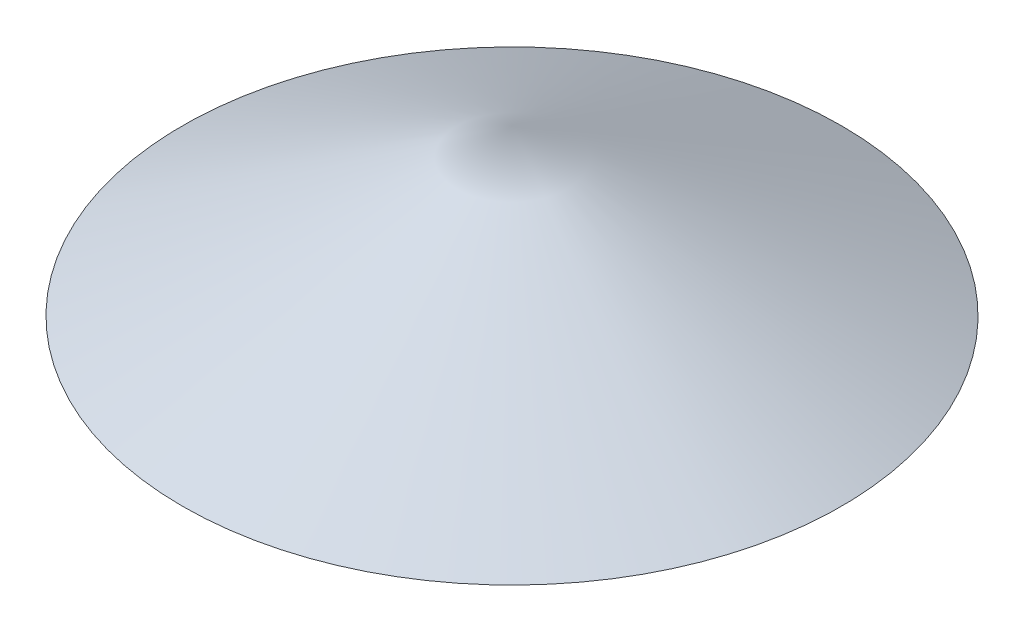
ISO-10303-21;
HEADER;
FILE_DESCRIPTION(('STEP AP214'),'2;1');
FILE_NAME('part.step','',(''),(''),'','','');
FILE_SCHEMA(('AUTOMOTIVE_DESIGN { 1 0 10303 214 1 1 1 1 }'));
ENDSEC;
DATA;
#1=APPLICATION_CONTEXT('core data for automotive mechanical design processes');
#2=APPLICATION_PROTOCOL_DEFINITION('international standard','automotive_design',2000,#1);
#3=PRODUCT_CONTEXT('',#1,'mechanical');
#4=PRODUCT('Part','Part','',(#3));
#5=PRODUCT_RELATED_PRODUCT_CATEGORY('part','',(#4));
#6=PRODUCT_DEFINITION_FORMATION('','',#4);
#7=PRODUCT_DEFINITION_CONTEXT('part definition',#1,'design');
#8=PRODUCT_DEFINITION('design','',#6,#7);
#9=PRODUCT_DEFINITION_SHAPE('','',#8);
#10=(LENGTH_UNIT() NAMED_UNIT(*) SI_UNIT(.MILLI.,.METRE.));
#11=(NAMED_UNIT(*) PLANE_ANGLE_UNIT() SI_UNIT($,.RADIAN.));
#12=(NAMED_UNIT(*) SI_UNIT($,.STERADIAN.) SOLID_ANGLE_UNIT());
#13=UNCERTAINTY_MEASURE_WITH_UNIT(LENGTH_MEASURE(1.E-05),#10,'distance_accuracy_value','');
#14=(GEOMETRIC_REPRESENTATION_CONTEXT(3) GLOBAL_UNCERTAINTY_ASSIGNED_CONTEXT((#13)) GLOBAL_UNIT_ASSIGNED_CONTEXT((#10,
#11,#12)) REPRESENTATION_CONTEXT('',''));
#15=CARTESIAN_POINT('',(0.,0.,0.));
#16=DIRECTION('',(0.,0.,1.));
#17=DIRECTION('',(1.,0.,0.));
#18=AXIS2_PLACEMENT_3D('',#15,#16,#17);
#19=CARTESIAN_POINT('',(0.,0.,0.));
#20=DIRECTION('',(0.,1.,0.));
#21=DIRECTION('',(0.,0.,1.));
#22=AXIS2_PLACEMENT_3D('',#19,#20,#21);
#23=PLANE('',#22);
#24=CARTESIAN_POINT('',(0.,0.,0.));
#25=DIRECTION('',(0.,1.,0.));
#26=DIRECTION('',(0.,0.,1.));
#27=AXIS2_PLACEMENT_3D('',#24,#25,#26);
#28=CIRCLE('',#27,30.);
#29=CARTESIAN_POINT('',(0.,0.,30.));
#30=VERTEX_POINT('',#29);
#31=EDGE_CURVE('E11',#30,#30,#28,.T.);
#32=ORIENTED_EDGE('',*,*,#31,.F.);
#33=EDGE_LOOP('',(#32));
#34=FACE_BOUND('',#33,.T.);
#35=ADVANCED_FACE('F37',(#34),#23,.F.);
#36=CARTESIAN_POINT('',(0.,0.,0.));
#37=DIRECTION('',(0.,-1.,0.));
#38=DIRECTION('',(0.,0.,-1.));
#39=AXIS2_PLACEMENT_3D('',#36,#37,#38);
#40=CONICAL_SURFACE('',#39,30.,1.10714871779409);
#41=CARTESIAN_POINT('',(0.,15.,0.));
#42=VERTEX_POINT('',#41);
#43=VERTEX_LOOP('',#42);
#44=FACE_BOUND('',#43,.T.);
#45=ORIENTED_EDGE('',*,*,#31,.T.);
#46=EDGE_LOOP('',(#45));
#47=FACE_BOUND('',#46,.T.);
#48=ADVANCED_FACE('F44',(#44,#47),#40,.T.);
#49=CLOSED_SHELL('',(#35,#48));
#50=MANIFOLD_SOLID_BREP('B2',#49);
#51=ADVANCED_BREP_SHAPE_REPRESENTATION('',(#18,#50),#14);
#52=SHAPE_DEFINITION_REPRESENTATION(#9,#51);
ENDSEC;
END-ISO-10303-21;
